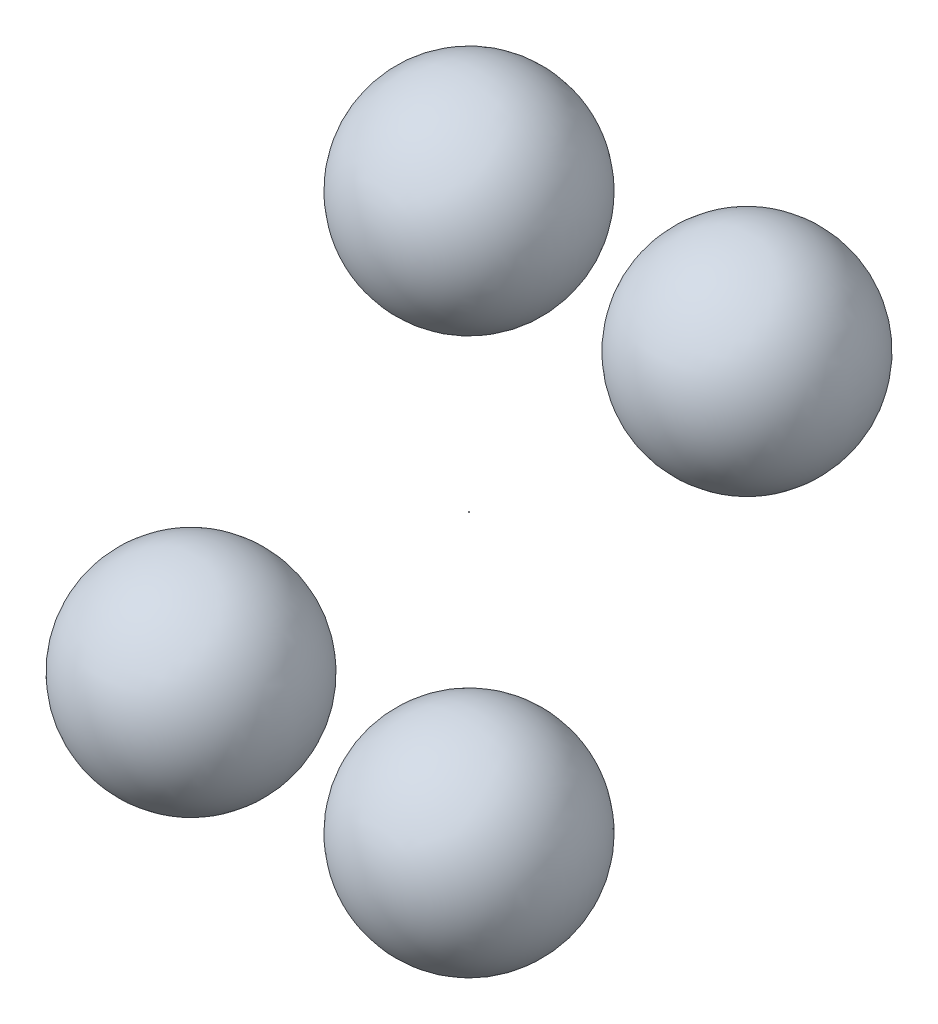
ISO-10303-21;
HEADER;
FILE_DESCRIPTION(('STEP AP214'),'2;1');
FILE_NAME('part.step','',(''),(''),'','','');
FILE_SCHEMA(('AUTOMOTIVE_DESIGN { 1 0 10303 214 1 1 1 1 }'));
ENDSEC;
DATA;
#1=APPLICATION_CONTEXT('core data for automotive mechanical design processes');
#2=APPLICATION_PROTOCOL_DEFINITION('international standard','automotive_design',2000,#1);
#3=PRODUCT_CONTEXT('',#1,'mechanical');
#4=PRODUCT('Part','Part','',(#3));
#5=PRODUCT_RELATED_PRODUCT_CATEGORY('part','',(#4));
#6=PRODUCT_DEFINITION_FORMATION('','',#4);
#7=PRODUCT_DEFINITION_CONTEXT('part definition',#1,'design');
#8=PRODUCT_DEFINITION('design','',#6,#7);
#9=PRODUCT_DEFINITION_SHAPE('','',#8);
#10=(LENGTH_UNIT() NAMED_UNIT(*) SI_UNIT(.MILLI.,.METRE.));
#11=(NAMED_UNIT(*) PLANE_ANGLE_UNIT() SI_UNIT($,.RADIAN.));
#12=(NAMED_UNIT(*) SI_UNIT($,.STERADIAN.) SOLID_ANGLE_UNIT());
#13=UNCERTAINTY_MEASURE_WITH_UNIT(LENGTH_MEASURE(1.E-05),#10,'distance_accuracy_value','');
#14=(GEOMETRIC_REPRESENTATION_CONTEXT(3) GLOBAL_UNCERTAINTY_ASSIGNED_CONTEXT((#13)) GLOBAL_UNIT_ASSIGNED_CONTEXT((#10,
#11,#12)) REPRESENTATION_CONTEXT('',''));
#15=CARTESIAN_POINT('',(0.,0.,0.));
#16=DIRECTION('',(0.,0.,1.));
#17=DIRECTION('',(1.,0.,0.));
#18=AXIS2_PLACEMENT_3D('',#15,#16,#17);
#19=CARTESIAN_POINT('',(0.,-3.25,0.));
#20=DIRECTION('',(0.,0.,-1.));
#21=DIRECTION('',(1.,0.,0.));
#22=AXIS2_PLACEMENT_3D('',#19,#20,#21);
#23=SPHERICAL_SURFACE('',#22,1.2);
#24=CARTESIAN_POINT('',(0.,-3.25,-1.2));
#25=VERTEX_POINT('',#24);
#26=VERTEX_LOOP('',#25);
#27=FACE_BOUND('',#26,.T.);
#28=ADVANCED_FACE('F11',(#27),#23,.T.);
#29=CLOSED_SHELL('',(#28));
#30=MANIFOLD_SOLID_BREP('B1',#29);
#31=CARTESIAN_POINT('',(0.,3.25,0.));
#32=DIRECTION('',(0.,0.,1.));
#33=DIRECTION('',(1.,0.,0.));
#34=AXIS2_PLACEMENT_3D('',#31,#32,#33);
#35=SPHERICAL_SURFACE('',#34,1.2);
#36=CARTESIAN_POINT('',(0.,3.25,1.2));
#37=VERTEX_POINT('',#36);
#38=VERTEX_LOOP('',#37);
#39=FACE_BOUND('',#38,.T.);
#40=ADVANCED_FACE('F19',(#39),#35,.T.);
#41=CLOSED_SHELL('',(#40));
#42=MANIFOLD_SOLID_BREP('B1',#41);
#43=CARTESIAN_POINT('',(0.,0.,0.));
#44=DIRECTION('',(0.,0.,1.));
#45=DIRECTION('',(1.,0.,0.));
#46=AXIS2_PLACEMENT_3D('',#43,#44,#45);
#47=SPHERICAL_SURFACE('',#46,0.005);
#48=CARTESIAN_POINT('',(0.,0.,0.005));
#49=VERTEX_POINT('',#48);
#50=VERTEX_LOOP('',#49);
#51=FACE_BOUND('',#50,.T.);
#52=ADVANCED_FACE('F29',(#51),#47,.T.);
#53=CLOSED_SHELL('',(#52));
#54=MANIFOLD_SOLID_BREP('B1',#53);
#55=CARTESIAN_POINT('',(0.,0.,3.25));
#56=DIRECTION('',(0.,-1.,0.));
#57=DIRECTION('',(1.,0.,0.));
#58=AXIS2_PLACEMENT_3D('',#55,#56,#57);
#59=SPHERICAL_SURFACE('',#58,1.2);
#60=CARTESIAN_POINT('',(0.,-1.2,3.25));
#61=VERTEX_POINT('',#60);
#62=VERTEX_LOOP('',#61);
#63=FACE_BOUND('',#62,.T.);
#64=ADVANCED_FACE('F32',(#63),#59,.T.);
#65=CLOSED_SHELL('',(#64));
#66=MANIFOLD_SOLID_BREP('B1',#65);
#67=CARTESIAN_POINT('',(0.,0.,-3.25));
#68=DIRECTION('',(0.,1.,0.));
#69=DIRECTION('',(1.,0.,0.));
#70=AXIS2_PLACEMENT_3D('',#67,#68,#69);
#71=SPHERICAL_SURFACE('',#70,1.2);
#72=CARTESIAN_POINT('',(0.,1.2,-3.25));
#73=VERTEX_POINT('',#72);
#74=VERTEX_LOOP('',#73);
#75=FACE_BOUND('',#74,.T.);
#76=ADVANCED_FACE('F13',(#75),#71,.T.);
#77=CLOSED_SHELL('',(#76));
#78=MANIFOLD_SOLID_BREP('B1',#77);
#79=ADVANCED_BREP_SHAPE_REPRESENTATION('',(#18,#30,#42,#54,#66,#78),#14);
#80=SHAPE_DEFINITION_REPRESENTATION(#9,#79);
ENDSEC;
END-ISO-10303-21;
